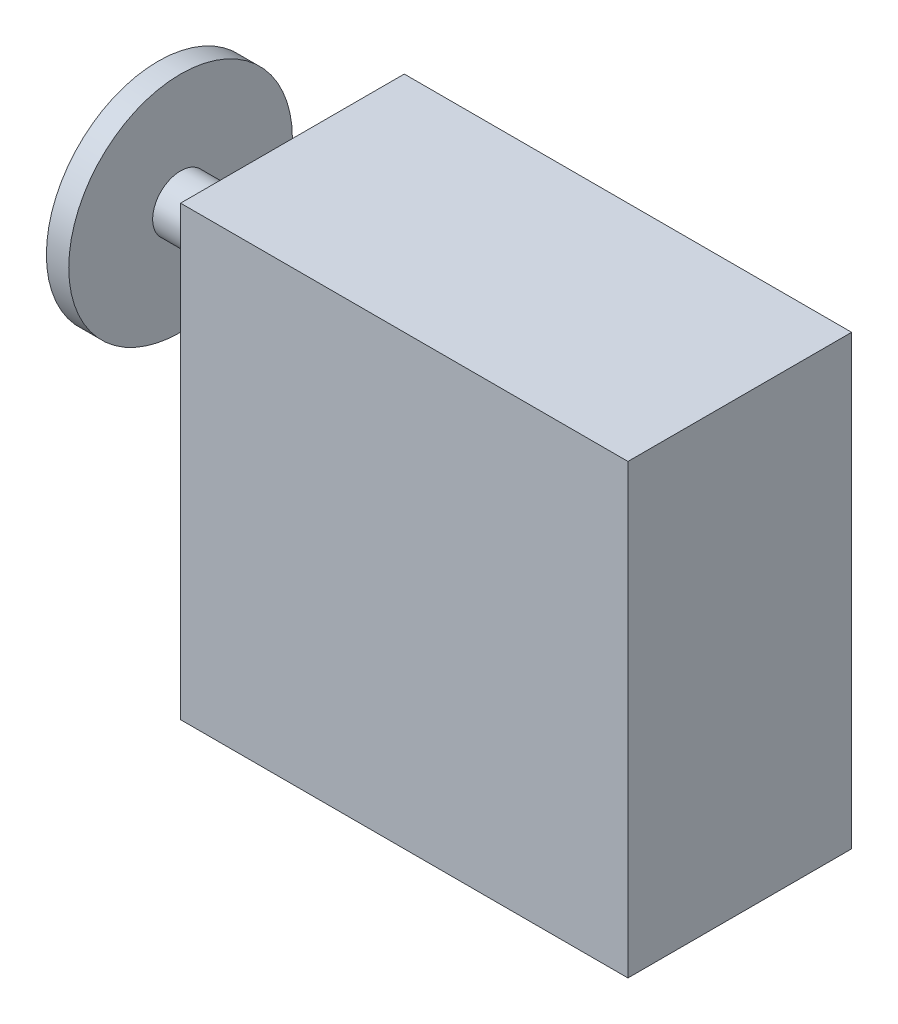
ISO-10303-21;
HEADER;
FILE_DESCRIPTION(('STEP AP214'),'2;1');
FILE_NAME('part.step','',(''),(''),'','','');
FILE_SCHEMA(('AUTOMOTIVE_DESIGN { 1 0 10303 214 1 1 1 1 }'));
ENDSEC;
DATA;
#1=APPLICATION_CONTEXT('core data for automotive mechanical design processes');
#2=APPLICATION_PROTOCOL_DEFINITION('international standard','automotive_design',2000,#1);
#3=PRODUCT_CONTEXT('',#1,'mechanical');
#4=PRODUCT('Part','Part','',(#3));
#5=PRODUCT_RELATED_PRODUCT_CATEGORY('part','',(#4));
#6=PRODUCT_DEFINITION_FORMATION('','',#4);
#7=PRODUCT_DEFINITION_CONTEXT('part definition',#1,'design');
#8=PRODUCT_DEFINITION('design','',#6,#7);
#9=PRODUCT_DEFINITION_SHAPE('','',#8);
#10=(LENGTH_UNIT() NAMED_UNIT(*) SI_UNIT(.MILLI.,.METRE.));
#11=(NAMED_UNIT(*) PLANE_ANGLE_UNIT() SI_UNIT($,.RADIAN.));
#12=(NAMED_UNIT(*) SI_UNIT($,.STERADIAN.) SOLID_ANGLE_UNIT());
#13=UNCERTAINTY_MEASURE_WITH_UNIT(LENGTH_MEASURE(1.E-05),#10,'distance_accuracy_value','');
#14=(GEOMETRIC_REPRESENTATION_CONTEXT(3) GLOBAL_UNCERTAINTY_ASSIGNED_CONTEXT((#13)) GLOBAL_UNIT_ASSIGNED_CONTEXT((#10,
#11,#12)) REPRESENTATION_CONTEXT('',''));
#15=CARTESIAN_POINT('',(0.,0.,0.));
#16=DIRECTION('',(0.,0.,1.));
#17=DIRECTION('',(1.,0.,0.));
#18=AXIS2_PLACEMENT_3D('',#15,#16,#17);
#19=CARTESIAN_POINT('',(20.,-20.,20.));
#20=DIRECTION('',(-1.,0.,0.));
#21=DIRECTION('',(0.,0.,1.));
#22=AXIS2_PLACEMENT_3D('',#19,#20,#21);
#23=PLANE('',#22);
#24=DIRECTION('',(0.,1.,0.));
#25=VECTOR('',#24,1.);
#26=CARTESIAN_POINT('',(20.,-20.,0.));
#27=LINE('',#26,#25);
#28=CARTESIAN_POINT('',(20.,-20.,0.));
#29=VERTEX_POINT('',#28);
#30=CARTESIAN_POINT('',(20.,20.,0.));
#31=VERTEX_POINT('',#30);
#32=EDGE_CURVE('E102',#29,#31,#27,.T.);
#33=ORIENTED_EDGE('',*,*,#32,.T.);
#34=DIRECTION('',(0.,0.,-1.));
#35=VECTOR('',#34,1.);
#36=CARTESIAN_POINT('',(20.,20.,20.));
#37=LINE('',#36,#35);
#38=CARTESIAN_POINT('',(20.,20.,20.));
#39=VERTEX_POINT('',#38);
#40=EDGE_CURVE('E44',#39,#31,#37,.T.);
#41=ORIENTED_EDGE('',*,*,#40,.F.);
#42=DIRECTION('',(0.,1.,0.));
#43=VECTOR('',#42,1.);
#44=CARTESIAN_POINT('',(20.,-20.,20.));
#45=LINE('',#44,#43);
#46=CARTESIAN_POINT('',(20.,-20.,20.));
#47=VERTEX_POINT('',#46);
#48=EDGE_CURVE('E88',#47,#39,#45,.T.);
#49=ORIENTED_EDGE('',*,*,#48,.F.);
#50=DIRECTION('',(0.,0.,-1.));
#51=VECTOR('',#50,1.);
#52=CARTESIAN_POINT('',(20.,-20.,20.));
#53=LINE('',#52,#51);
#54=EDGE_CURVE('E98',#47,#29,#53,.T.);
#55=ORIENTED_EDGE('',*,*,#54,.T.);
#56=EDGE_LOOP('',(#33,#41,#49,#55));
#57=FACE_BOUND('',#56,.T.);
#58=ADVANCED_FACE('F36',(#57),#23,.F.);
#59=CARTESIAN_POINT('',(-20.,20.,20.));
#60=DIRECTION('',(0.,-1.,0.));
#61=DIRECTION('',(0.,0.,-1.));
#62=AXIS2_PLACEMENT_3D('',#59,#60,#61);
#63=PLANE('',#62);
#64=DIRECTION('',(-1.,0.,0.));
#65=VECTOR('',#64,1.);
#66=CARTESIAN_POINT('',(-20.,20.,0.));
#67=LINE('',#66,#65);
#68=CARTESIAN_POINT('',(-20.,20.,0.));
#69=VERTEX_POINT('',#68);
#70=EDGE_CURVE('E93',#31,#69,#67,.T.);
#71=ORIENTED_EDGE('',*,*,#70,.T.);
#72=DIRECTION('',(0.,0.,-1.));
#73=VECTOR('',#72,1.);
#74=CARTESIAN_POINT('',(-20.,20.,20.));
#75=LINE('',#74,#73);
#76=CARTESIAN_POINT('',(-20.,20.,20.));
#77=VERTEX_POINT('',#76);
#78=EDGE_CURVE('E91',#77,#69,#75,.T.);
#79=ORIENTED_EDGE('',*,*,#78,.F.);
#80=DIRECTION('',(-1.,0.,0.));
#81=VECTOR('',#80,1.);
#82=CARTESIAN_POINT('',(-20.,20.,20.));
#83=LINE('',#82,#81);
#84=EDGE_CURVE('E83',#39,#77,#83,.T.);
#85=ORIENTED_EDGE('',*,*,#84,.F.);
#86=ORIENTED_EDGE('',*,*,#40,.T.);
#87=EDGE_LOOP('',(#71,#79,#85,#86));
#88=FACE_BOUND('',#87,.T.);
#89=ADVANCED_FACE('F92',(#88),#63,.F.);
#90=CARTESIAN_POINT('',(-20.,-20.,20.));
#91=DIRECTION('',(1.,0.,0.));
#92=DIRECTION('',(0.,0.,-1.));
#93=AXIS2_PLACEMENT_3D('',#90,#91,#92);
#94=PLANE('',#93);
#95=CARTESIAN_POINT('',(-20.,10.,10.));
#96=DIRECTION('',(1.,0.,0.));
#97=DIRECTION('',(0.,0.,-1.));
#98=AXIS2_PLACEMENT_3D('',#95,#96,#97);
#99=CIRCLE('',#98,2.5);
#100=CARTESIAN_POINT('',(-20.,10.,7.5));
#101=VERTEX_POINT('',#100);
#102=EDGE_CURVE('E11',#101,#101,#99,.F.);
#103=ORIENTED_EDGE('',*,*,#102,.F.);
#104=EDGE_LOOP('',(#103));
#105=FACE_BOUND('',#104,.T.);
#106=DIRECTION('',(0.,-1.,0.));
#107=VECTOR('',#106,1.);
#108=CARTESIAN_POINT('',(-20.,-20.,0.));
#109=LINE('',#108,#107);
#110=CARTESIAN_POINT('',(-20.,-20.,0.));
#111=VERTEX_POINT('',#110);
#112=EDGE_CURVE('E69',#69,#111,#109,.T.);
#113=ORIENTED_EDGE('',*,*,#112,.T.);
#114=DIRECTION('',(0.,0.,-1.));
#115=VECTOR('',#114,1.);
#116=CARTESIAN_POINT('',(-20.,-20.,20.));
#117=LINE('',#116,#115);
#118=CARTESIAN_POINT('',(-20.,-20.,20.));
#119=VERTEX_POINT('',#118);
#120=EDGE_CURVE('E94',#119,#111,#117,.T.);
#121=ORIENTED_EDGE('',*,*,#120,.F.);
#122=DIRECTION('',(0.,-1.,0.));
#123=VECTOR('',#122,1.);
#124=CARTESIAN_POINT('',(-20.,-20.,20.));
#125=LINE('',#124,#123);
#126=EDGE_CURVE('E86',#77,#119,#125,.T.);
#127=ORIENTED_EDGE('',*,*,#126,.F.);
#128=ORIENTED_EDGE('',*,*,#78,.T.);
#129=EDGE_LOOP('',(#113,#121,#127,#128));
#130=FACE_BOUND('',#129,.T.);
#131=ADVANCED_FACE('F96',(#105,#130),#94,.F.);
#132=CARTESIAN_POINT('',(-20.,-20.,20.));
#133=DIRECTION('',(0.,1.,0.));
#134=DIRECTION('',(0.,0.,1.));
#135=AXIS2_PLACEMENT_3D('',#132,#133,#134);
#136=PLANE('',#135);
#137=DIRECTION('',(1.,0.,0.));
#138=VECTOR('',#137,1.);
#139=CARTESIAN_POINT('',(-20.,-20.,0.));
#140=LINE('',#139,#138);
#141=EDGE_CURVE('E75',#111,#29,#140,.T.);
#142=ORIENTED_EDGE('',*,*,#141,.T.);
#143=ORIENTED_EDGE('',*,*,#54,.F.);
#144=DIRECTION('',(1.,0.,0.));
#145=VECTOR('',#144,1.);
#146=CARTESIAN_POINT('',(-20.,-20.,20.));
#147=LINE('',#146,#145);
#148=EDGE_CURVE('E52',#119,#47,#147,.T.);
#149=ORIENTED_EDGE('',*,*,#148,.F.);
#150=ORIENTED_EDGE('',*,*,#120,.T.);
#151=EDGE_LOOP('',(#142,#143,#149,#150));
#152=FACE_BOUND('',#151,.T.);
#153=ADVANCED_FACE('F124',(#152),#136,.F.);
#154=CARTESIAN_POINT('',(0.,0.,20.));
#155=DIRECTION('',(0.,0.,-1.));
#156=DIRECTION('',(-1.,0.,0.));
#157=AXIS2_PLACEMENT_3D('',#154,#155,#156);
#158=PLANE('',#157);
#159=ORIENTED_EDGE('',*,*,#48,.T.);
#160=ORIENTED_EDGE('',*,*,#84,.T.);
#161=ORIENTED_EDGE('',*,*,#126,.T.);
#162=ORIENTED_EDGE('',*,*,#148,.T.);
#163=EDGE_LOOP('',(#159,#160,#161,#162));
#164=FACE_BOUND('',#163,.T.);
#165=ADVANCED_FACE('F84',(#164),#158,.F.);
#166=CARTESIAN_POINT('',(0.,0.,0.));
#167=DIRECTION('',(0.,0.,-1.));
#168=DIRECTION('',(-1.,0.,0.));
#169=AXIS2_PLACEMENT_3D('',#166,#167,#168);
#170=PLANE('',#169);
#171=ORIENTED_EDGE('',*,*,#32,.F.);
#172=ORIENTED_EDGE('',*,*,#141,.F.);
#173=ORIENTED_EDGE('',*,*,#112,.F.);
#174=ORIENTED_EDGE('',*,*,#70,.F.);
#175=EDGE_LOOP('',(#171,#172,#173,#174));
#176=FACE_BOUND('',#175,.T.);
#177=ADVANCED_FACE('F113',(#176),#170,.T.);
#178=CARTESIAN_POINT('',(-30.,10.,10.));
#179=DIRECTION('',(1.,0.,0.));
#180=DIRECTION('',(0.,0.,-1.));
#181=AXIS2_PLACEMENT_3D('',#178,#179,#180);
#182=CYLINDRICAL_SURFACE('',#181,2.5);
#183=CARTESIAN_POINT('',(-30.,10.,10.));
#184=DIRECTION('',(-1.,0.,0.));
#185=DIRECTION('',(0.,0.,1.));
#186=AXIS2_PLACEMENT_3D('',#183,#184,#185);
#187=CIRCLE('',#186,2.5);
#188=CARTESIAN_POINT('',(-30.,10.,12.5));
#189=VERTEX_POINT('',#188);
#190=EDGE_CURVE('E105',#189,#189,#187,.T.);
#191=ORIENTED_EDGE('',*,*,#190,.F.);
#192=EDGE_LOOP('',(#191));
#193=FACE_BOUND('',#192,.T.);
#194=ORIENTED_EDGE('',*,*,#102,.T.);
#195=EDGE_LOOP('',(#194));
#196=FACE_BOUND('',#195,.T.);
#197=ADVANCED_FACE('F115',(#193,#196),#182,.T.);
#198=CARTESIAN_POINT('',(-32.,10.,10.));
#199=DIRECTION('',(1.,0.,0.));
#200=DIRECTION('',(0.,0.,-1.));
#201=AXIS2_PLACEMENT_3D('',#198,#199,#200);
#202=CYLINDRICAL_SURFACE('',#201,10.);
#203=CARTESIAN_POINT('',(-32.,10.,10.));
#204=DIRECTION('',(-1.,0.,0.));
#205=DIRECTION('',(0.,0.,1.));
#206=AXIS2_PLACEMENT_3D('',#203,#204,#205);
#207=CIRCLE('',#206,10.);
#208=CARTESIAN_POINT('',(-32.,10.,20.));
#209=VERTEX_POINT('',#208);
#210=EDGE_CURVE('E200',#209,#209,#207,.T.);
#211=ORIENTED_EDGE('',*,*,#210,.F.);
#212=EDGE_LOOP('',(#211));
#213=FACE_BOUND('',#212,.T.);
#214=CARTESIAN_POINT('',(-30.,10.,10.));
#215=DIRECTION('',(-1.,0.,0.));
#216=DIRECTION('',(0.,0.,1.));
#217=AXIS2_PLACEMENT_3D('',#214,#215,#216);
#218=CIRCLE('',#217,10.);
#219=CARTESIAN_POINT('',(-30.,10.,20.));
#220=VERTEX_POINT('',#219);
#221=EDGE_CURVE('E198',#220,#220,#218,.T.);
#222=ORIENTED_EDGE('',*,*,#221,.T.);
#223=EDGE_LOOP('',(#222));
#224=FACE_BOUND('',#223,.T.);
#225=ADVANCED_FACE('F121',(#213,#224),#202,.T.);
#226=CARTESIAN_POINT('',(-32.,10.,10.));
#227=DIRECTION('',(-1.,0.,0.));
#228=DIRECTION('',(0.,0.,1.));
#229=AXIS2_PLACEMENT_3D('',#226,#227,#228);
#230=PLANE('',#229);
#231=ORIENTED_EDGE('',*,*,#210,.T.);
#232=EDGE_LOOP('',(#231));
#233=FACE_BOUND('',#232,.T.);
#234=ADVANCED_FACE('F169',(#233),#230,.T.);
#235=CARTESIAN_POINT('',(-30.,10.,10.));
#236=DIRECTION('',(-1.,0.,0.));
#237=DIRECTION('',(0.,0.,1.));
#238=AXIS2_PLACEMENT_3D('',#235,#236,#237);
#239=PLANE('',#238);
#240=ORIENTED_EDGE('',*,*,#190,.T.);
#241=EDGE_LOOP('',(#240));
#242=FACE_BOUND('',#241,.T.);
#243=ORIENTED_EDGE('',*,*,#221,.F.);
#244=EDGE_LOOP('',(#243));
#245=FACE_BOUND('',#244,.T.);
#246=ADVANCED_FACE('F179',(#242,#245),#239,.F.);
#247=CLOSED_SHELL('',(#58,#89,#131,#153,#165,#177,#197,#225,#234,#246));
#248=MANIFOLD_SOLID_BREP('B2',#247);
#249=ADVANCED_BREP_SHAPE_REPRESENTATION('',(#18,#248),#14);
#250=SHAPE_DEFINITION_REPRESENTATION(#9,#249);
ENDSEC;
END-ISO-10303-21;
